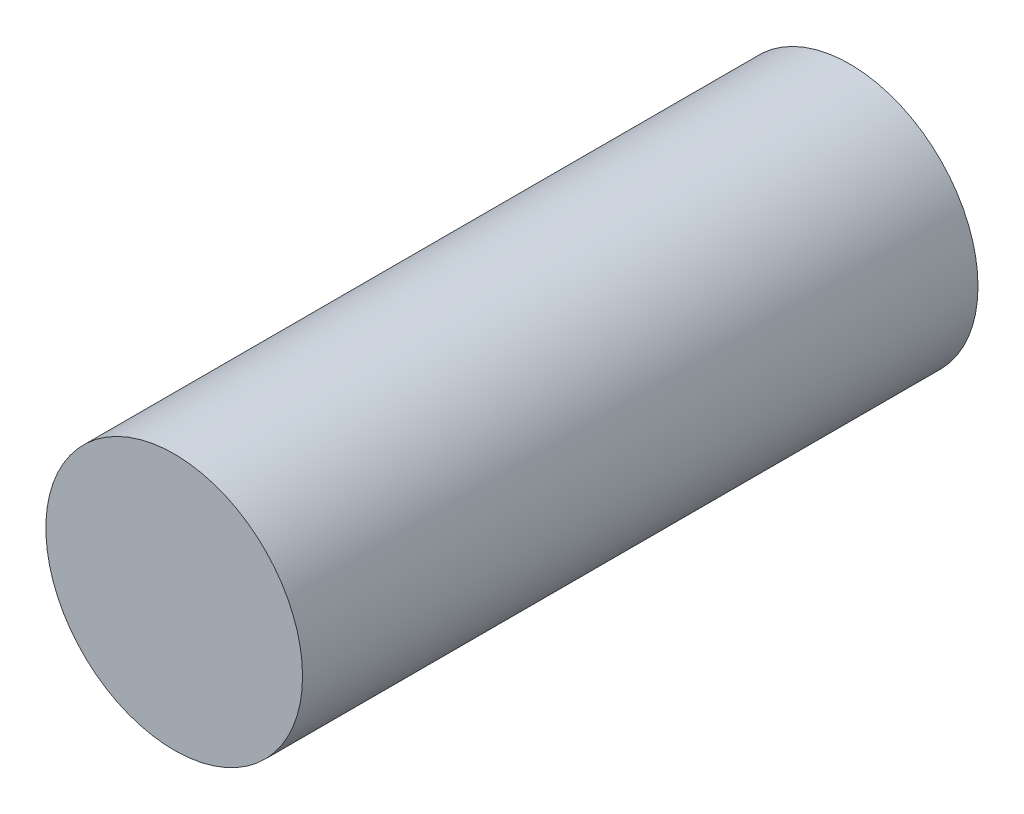
ISO-10303-21;
HEADER;
FILE_DESCRIPTION(('STEP AP214'),'2;1');
FILE_NAME('part.step','',(''),(''),'','','');
FILE_SCHEMA(('AUTOMOTIVE_DESIGN { 1 0 10303 214 1 1 1 1 }'));
ENDSEC;
DATA;
#1=APPLICATION_CONTEXT('core data for automotive mechanical design processes');
#2=APPLICATION_PROTOCOL_DEFINITION('international standard','automotive_design',2000,#1);
#3=PRODUCT_CONTEXT('',#1,'mechanical');
#4=PRODUCT('Part','Part','',(#3));
#5=PRODUCT_RELATED_PRODUCT_CATEGORY('part','',(#4));
#6=PRODUCT_DEFINITION_FORMATION('','',#4);
#7=PRODUCT_DEFINITION_CONTEXT('part definition',#1,'design');
#8=PRODUCT_DEFINITION('design','',#6,#7);
#9=PRODUCT_DEFINITION_SHAPE('','',#8);
#10=(LENGTH_UNIT() NAMED_UNIT(*) SI_UNIT(.MILLI.,.METRE.));
#11=(NAMED_UNIT(*) PLANE_ANGLE_UNIT() SI_UNIT($,.RADIAN.));
#12=(NAMED_UNIT(*) SI_UNIT($,.STERADIAN.) SOLID_ANGLE_UNIT());
#13=UNCERTAINTY_MEASURE_WITH_UNIT(LENGTH_MEASURE(1.E-05),#10,'distance_accuracy_value','');
#14=(GEOMETRIC_REPRESENTATION_CONTEXT(3) GLOBAL_UNCERTAINTY_ASSIGNED_CONTEXT((#13)) GLOBAL_UNIT_ASSIGNED_CONTEXT((#10,
#11,#12)) REPRESENTATION_CONTEXT('',''));
#15=CARTESIAN_POINT('',(0.,0.,0.));
#16=DIRECTION('',(0.,0.,1.));
#17=DIRECTION('',(1.,0.,0.));
#18=AXIS2_PLACEMENT_3D('',#15,#16,#17);
#19=CARTESIAN_POINT('',(0.,0.,-25.));
#20=DIRECTION('',(0.,0.,1.));
#21=DIRECTION('',(1.,0.,0.));
#22=AXIS2_PLACEMENT_3D('',#19,#20,#21);
#23=CYLINDRICAL_SURFACE('',#22,4.75);
#24=CARTESIAN_POINT('',(0.,0.,-25.));
#25=DIRECTION('',(0.,0.,1.));
#26=DIRECTION('',(1.,0.,0.));
#27=AXIS2_PLACEMENT_3D('',#24,#25,#26);
#28=CIRCLE('',#27,4.75);
#29=CARTESIAN_POINT('',(4.75,0.,-25.));
#30=VERTEX_POINT('',#29);
#31=EDGE_CURVE('E10',#30,#30,#28,.T.);
#32=ORIENTED_EDGE('',*,*,#31,.T.);
#33=EDGE_LOOP('',(#32));
#34=FACE_BOUND('',#33,.T.);
#35=CARTESIAN_POINT('',(0.,0.,0.));
#36=DIRECTION('',(0.,0.,1.));
#37=DIRECTION('',(1.,0.,0.));
#38=AXIS2_PLACEMENT_3D('',#35,#36,#37);
#39=CIRCLE('',#38,4.75);
#40=CARTESIAN_POINT('',(4.75,0.,0.));
#41=VERTEX_POINT('',#40);
#42=EDGE_CURVE('E46',#41,#41,#39,.T.);
#43=ORIENTED_EDGE('',*,*,#42,.F.);
#44=EDGE_LOOP('',(#43));
#45=FACE_BOUND('',#44,.T.);
#46=ADVANCED_FACE('F43',(#34,#45),#23,.T.);
#47=CARTESIAN_POINT('',(0.,0.,-25.));
#48=DIRECTION('',(0.,0.,1.));
#49=DIRECTION('',(1.,0.,0.));
#50=AXIS2_PLACEMENT_3D('',#47,#48,#49);
#51=PLANE('',#50);
#52=ORIENTED_EDGE('',*,*,#31,.F.);
#53=EDGE_LOOP('',(#52));
#54=FACE_BOUND('',#53,.T.);
#55=ADVANCED_FACE('F58',(#54),#51,.F.);
#56=CARTESIAN_POINT('',(0.,0.,0.));
#57=DIRECTION('',(0.,0.,1.));
#58=DIRECTION('',(1.,0.,0.));
#59=AXIS2_PLACEMENT_3D('',#56,#57,#58);
#60=PLANE('',#59);
#61=ORIENTED_EDGE('',*,*,#42,.T.);
#62=EDGE_LOOP('',(#61));
#63=FACE_BOUND('',#62,.T.);
#64=ADVANCED_FACE('F60',(#63),#60,.T.);
#65=CLOSED_SHELL('',(#46,#55,#64));
#66=MANIFOLD_SOLID_BREP('B2',#65);
#67=ADVANCED_BREP_SHAPE_REPRESENTATION('',(#18,#66),#14);
#68=SHAPE_DEFINITION_REPRESENTATION(#9,#67);
ENDSEC;
END-ISO-10303-21;
